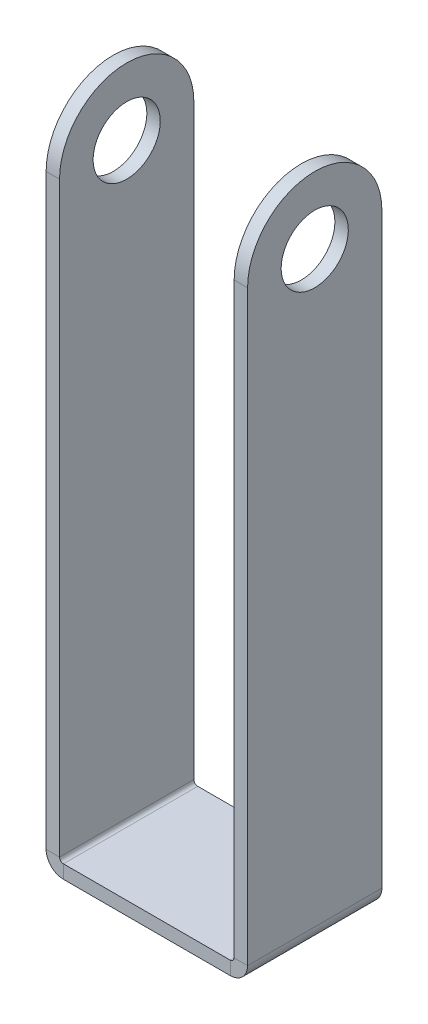
ISO-10303-21;
HEADER;
FILE_DESCRIPTION(('STEP AP214'),'2;1');
FILE_NAME('part.step','',(''),(''),'','','');
FILE_SCHEMA(('AUTOMOTIVE_DESIGN { 1 0 10303 214 1 1 1 1 }'));
ENDSEC;
DATA;
#1=APPLICATION_CONTEXT('core data for automotive mechanical design processes');
#2=APPLICATION_PROTOCOL_DEFINITION('international standard','automotive_design',2000,#1);
#3=PRODUCT_CONTEXT('',#1,'mechanical');
#4=PRODUCT('Part','Part','',(#3));
#5=PRODUCT_RELATED_PRODUCT_CATEGORY('part','',(#4));
#6=PRODUCT_DEFINITION_FORMATION('','',#4);
#7=PRODUCT_DEFINITION_CONTEXT('part definition',#1,'design');
#8=PRODUCT_DEFINITION('design','',#6,#7);
#9=PRODUCT_DEFINITION_SHAPE('','',#8);
#10=(LENGTH_UNIT() NAMED_UNIT(*) SI_UNIT(.MILLI.,.METRE.));
#11=(NAMED_UNIT(*) PLANE_ANGLE_UNIT() SI_UNIT($,.RADIAN.));
#12=(NAMED_UNIT(*) SI_UNIT($,.STERADIAN.) SOLID_ANGLE_UNIT());
#13=UNCERTAINTY_MEASURE_WITH_UNIT(LENGTH_MEASURE(1.E-05),#10,'distance_accuracy_value','');
#14=(GEOMETRIC_REPRESENTATION_CONTEXT(3) GLOBAL_UNCERTAINTY_ASSIGNED_CONTEXT((#13)) GLOBAL_UNIT_ASSIGNED_CONTEXT((#10,
#11,#12)) REPRESENTATION_CONTEXT('',''));
#15=CARTESIAN_POINT('',(0.,0.,0.));
#16=DIRECTION('',(0.,0.,1.));
#17=DIRECTION('',(1.,0.,0.));
#18=AXIS2_PLACEMENT_3D('',#15,#16,#17);
#19=CARTESIAN_POINT('',(19.05,0.,0.));
#20=DIRECTION('',(-1.,0.,0.));
#21=DIRECTION('',(0.,-1.,0.));
#22=AXIS2_PLACEMENT_3D('',#19,#20,#21);
#23=PLANE('',#22);
#24=CARTESIAN_POINT('',(19.0500000000004,111.76,0.));
#25=DIRECTION('',(1.,0.,0.));
#26=DIRECTION('',(0.,1.,0.));
#27=AXIS2_PLACEMENT_3D('',#24,#25,#26);
#28=CIRCLE('',#27,6.35);
#29=CARTESIAN_POINT('',(19.0500000000004,118.11,0.));
#30=VERTEX_POINT('',#29);
#31=EDGE_CURVE('E595',#30,#30,#28,.T.);
#32=ORIENTED_EDGE('',*,*,#31,.F.);
#33=EDGE_LOOP('',(#32));
#34=FACE_BOUND('',#33,.T.);
#35=CARTESIAN_POINT('',(19.0500000000004,111.76,0.));
#36=DIRECTION('',(1.,0.,0.));
#37=DIRECTION('',(0.,1.,0.));
#38=AXIS2_PLACEMENT_3D('',#35,#36,#37);
#39=CIRCLE('',#38,12.7);
#40=CARTESIAN_POINT('',(19.0500000000004,111.76,-12.7));
#41=VERTEX_POINT('',#40);
#42=CARTESIAN_POINT('',(19.0500000000004,111.76,12.7));
#43=VERTEX_POINT('',#42);
#44=EDGE_CURVE('E181',#41,#43,#39,.T.);
#45=ORIENTED_EDGE('',*,*,#44,.T.);
#46=DIRECTION('',(0.,-1.,0.));
#47=VECTOR('',#46,1.);
#48=CARTESIAN_POINT('',(19.05,0.,12.7));
#49=LINE('',#48,#47);
#50=CARTESIAN_POINT('',(19.05,0.736599999999988,12.7));
#51=VERTEX_POINT('',#50);
#52=EDGE_CURVE('E238',#43,#51,#49,.T.);
#53=ORIENTED_EDGE('',*,*,#52,.T.);
#54=DIRECTION('',(0.,0.,-1.));
#55=VECTOR('',#54,1.);
#56=CARTESIAN_POINT('',(19.05,0.736599999999988,12.7));
#57=LINE('',#56,#55);
#58=CARTESIAN_POINT('',(19.05,0.736599999999988,-12.7));
#59=VERTEX_POINT('',#58);
#60=EDGE_CURVE('E249',#59,#51,#57,.F.);
#61=ORIENTED_EDGE('',*,*,#60,.F.);
#62=DIRECTION('',(0.,1.,0.));
#63=VECTOR('',#62,1.);
#64=CARTESIAN_POINT('',(19.05,0.,-12.7));
#65=LINE('',#64,#63);
#66=EDGE_CURVE('E241',#59,#41,#65,.T.);
#67=ORIENTED_EDGE('',*,*,#66,.T.);
#68=EDGE_LOOP('',(#45,#53,#61,#67));
#69=FACE_BOUND('',#68,.T.);
#70=ADVANCED_FACE('F79',(#34,#69),#23,.F.);
#71=CARTESIAN_POINT('',(16.51,0.,0.));
#72=DIRECTION('',(-1.,0.,0.));
#73=DIRECTION('',(0.,-1.,0.));
#74=AXIS2_PLACEMENT_3D('',#71,#72,#73);
#75=PLANE('',#74);
#76=CARTESIAN_POINT('',(16.5100000000004,111.76,0.));
#77=DIRECTION('',(-1.,0.,0.));
#78=DIRECTION('',(0.,-1.,0.));
#79=AXIS2_PLACEMENT_3D('',#76,#77,#78);
#80=CIRCLE('',#79,6.35);
#81=CARTESIAN_POINT('',(16.5100000000004,105.41,0.));
#82=VERTEX_POINT('',#81);
#83=EDGE_CURVE('E593',#82,#82,#80,.T.);
#84=ORIENTED_EDGE('',*,*,#83,.F.);
#85=EDGE_LOOP('',(#84));
#86=FACE_BOUND('',#85,.T.);
#87=DIRECTION('',(0.,1.,0.));
#88=VECTOR('',#87,1.);
#89=CARTESIAN_POINT('',(16.51,0.,12.7));
#90=LINE('',#89,#88);
#91=CARTESIAN_POINT('',(16.5100000000002,111.76,12.7));
#92=VERTEX_POINT('',#91);
#93=CARTESIAN_POINT('',(16.51,0.736599999999997,12.7));
#94=VERTEX_POINT('',#93);
#95=EDGE_CURVE('E244',#92,#94,#90,.F.);
#96=ORIENTED_EDGE('',*,*,#95,.F.);
#97=CARTESIAN_POINT('',(16.5100000000004,111.76,0.));
#98=DIRECTION('',(-1.,0.,0.));
#99=DIRECTION('',(0.,-1.,0.));
#100=AXIS2_PLACEMENT_3D('',#97,#98,#99);
#101=CIRCLE('',#100,12.7);
#102=CARTESIAN_POINT('',(16.5100000000004,111.76,-12.7));
#103=VERTEX_POINT('',#102);
#104=EDGE_CURVE('E204',#92,#103,#101,.T.);
#105=ORIENTED_EDGE('',*,*,#104,.T.);
#106=DIRECTION('',(0.,-1.,0.));
#107=VECTOR('',#106,1.);
#108=CARTESIAN_POINT('',(16.5100000000004,124.46,-12.7));
#109=LINE('',#108,#107);
#110=CARTESIAN_POINT('',(16.51,0.736599999999997,-12.7));
#111=VERTEX_POINT('',#110);
#112=EDGE_CURVE('E246',#111,#103,#109,.F.);
#113=ORIENTED_EDGE('',*,*,#112,.F.);
#114=DIRECTION('',(0.,0.,-1.));
#115=VECTOR('',#114,1.);
#116=CARTESIAN_POINT('',(16.51,0.736599999999997,12.7));
#117=LINE('',#116,#115);
#118=EDGE_CURVE('E255',#94,#111,#117,.T.);
#119=ORIENTED_EDGE('',*,*,#118,.F.);
#120=EDGE_LOOP('',(#96,#105,#113,#119));
#121=FACE_BOUND('',#120,.T.);
#122=ADVANCED_FACE('F304',(#86,#121),#75,.T.);
#123=CARTESIAN_POINT('',(-19.05,0.,0.));
#124=DIRECTION('',(1.,0.,0.));
#125=DIRECTION('',(0.,1.,0.));
#126=AXIS2_PLACEMENT_3D('',#123,#124,#125);
#127=PLANE('',#126);
#128=CARTESIAN_POINT('',(-19.0500000000005,111.76,0.));
#129=DIRECTION('',(1.,0.,0.));
#130=DIRECTION('',(0.,1.,0.));
#131=AXIS2_PLACEMENT_3D('',#128,#129,#130);
#132=CIRCLE('',#131,6.35);
#133=CARTESIAN_POINT('',(-19.0500000000005,118.11,0.));
#134=VERTEX_POINT('',#133);
#135=EDGE_CURVE('E596',#134,#134,#132,.T.);
#136=ORIENTED_EDGE('',*,*,#135,.T.);
#137=EDGE_LOOP('',(#136));
#138=FACE_BOUND('',#137,.T.);
#139=DIRECTION('',(0.,1.,0.));
#140=VECTOR('',#139,1.);
#141=CARTESIAN_POINT('',(-19.05,0.,12.7));
#142=LINE('',#141,#140);
#143=CARTESIAN_POINT('',(-19.05,0.736599999999985,12.7));
#144=VERTEX_POINT('',#143);
#145=CARTESIAN_POINT('',(-19.0500000000005,111.76,12.7));
#146=VERTEX_POINT('',#145);
#147=EDGE_CURVE('E187',#144,#146,#142,.T.);
#148=ORIENTED_EDGE('',*,*,#147,.T.);
#149=CARTESIAN_POINT('',(-19.0500000000005,111.76,0.));
#150=DIRECTION('',(1.,0.,0.));
#151=DIRECTION('',(0.,1.,0.));
#152=AXIS2_PLACEMENT_3D('',#149,#150,#151);
#153=CIRCLE('',#152,12.7);
#154=CARTESIAN_POINT('',(-19.0500000000005,111.76,-12.7));
#155=VERTEX_POINT('',#154);
#156=EDGE_CURVE('E170',#155,#146,#153,.T.);
#157=ORIENTED_EDGE('',*,*,#156,.F.);
#158=DIRECTION('',(0.,-1.,0.));
#159=VECTOR('',#158,1.);
#160=CARTESIAN_POINT('',(-19.05,0.,-12.7));
#161=LINE('',#160,#159);
#162=CARTESIAN_POINT('',(-19.05,0.736599999999988,-12.7));
#163=VERTEX_POINT('',#162);
#164=EDGE_CURVE('E197',#155,#163,#161,.T.);
#165=ORIENTED_EDGE('',*,*,#164,.T.);
#166=DIRECTION('',(0.,0.,1.));
#167=VECTOR('',#166,1.);
#168=CARTESIAN_POINT('',(-19.05,0.736599999999988,-12.7));
#169=LINE('',#168,#167);
#170=EDGE_CURVE('E195',#144,#163,#169,.F.);
#171=ORIENTED_EDGE('',*,*,#170,.F.);
#172=EDGE_LOOP('',(#148,#157,#165,#171));
#173=FACE_BOUND('',#172,.T.);
#174=ADVANCED_FACE('F193',(#138,#173),#127,.F.);
#175=CARTESIAN_POINT('',(-16.51,0.,0.));
#176=DIRECTION('',(1.,0.,0.));
#177=DIRECTION('',(0.,1.,0.));
#178=AXIS2_PLACEMENT_3D('',#175,#176,#177);
#179=PLANE('',#178);
#180=CARTESIAN_POINT('',(-16.5100000000004,111.76,0.));
#181=DIRECTION('',(1.,0.,0.));
#182=DIRECTION('',(0.,1.,0.));
#183=AXIS2_PLACEMENT_3D('',#180,#181,#182);
#184=CIRCLE('',#183,6.35);
#185=CARTESIAN_POINT('',(-16.5100000000004,118.11,0.));
#186=VERTEX_POINT('',#185);
#187=EDGE_CURVE('E83',#186,#186,#184,.T.);
#188=ORIENTED_EDGE('',*,*,#187,.F.);
#189=EDGE_LOOP('',(#188));
#190=FACE_BOUND('',#189,.T.);
#191=CARTESIAN_POINT('',(-16.5100000000004,111.76,0.));
#192=DIRECTION('',(1.,0.,0.));
#193=DIRECTION('',(0.,1.,0.));
#194=AXIS2_PLACEMENT_3D('',#191,#192,#193);
#195=CIRCLE('',#194,12.7);
#196=CARTESIAN_POINT('',(-16.5100000000004,111.76,-12.7));
#197=VERTEX_POINT('',#196);
#198=CARTESIAN_POINT('',(-16.5100000000002,111.76,12.7));
#199=VERTEX_POINT('',#198);
#200=EDGE_CURVE('E337',#197,#199,#195,.T.);
#201=ORIENTED_EDGE('',*,*,#200,.T.);
#202=DIRECTION('',(0.,-1.,0.));
#203=VECTOR('',#202,1.);
#204=CARTESIAN_POINT('',(-16.5100000000004,124.46,12.7));
#205=LINE('',#204,#203);
#206=CARTESIAN_POINT('',(-16.51,0.736599999999993,12.7));
#207=VERTEX_POINT('',#206);
#208=EDGE_CURVE('E189',#207,#199,#205,.F.);
#209=ORIENTED_EDGE('',*,*,#208,.F.);
#210=DIRECTION('',(0.,0.,1.));
#211=VECTOR('',#210,1.);
#212=CARTESIAN_POINT('',(-16.51,0.736599999999997,-12.7));
#213=LINE('',#212,#211);
#214=CARTESIAN_POINT('',(-16.51,0.736599999999997,-12.7));
#215=VERTEX_POINT('',#214);
#216=EDGE_CURVE('E214',#215,#207,#213,.T.);
#217=ORIENTED_EDGE('',*,*,#216,.F.);
#218=DIRECTION('',(0.,1.,0.));
#219=VECTOR('',#218,1.);
#220=CARTESIAN_POINT('',(-16.51,0.,-12.7));
#221=LINE('',#220,#219);
#222=EDGE_CURVE('E208',#197,#215,#221,.F.);
#223=ORIENTED_EDGE('',*,*,#222,.F.);
#224=EDGE_LOOP('',(#201,#209,#217,#223));
#225=FACE_BOUND('',#224,.T.);
#226=ADVANCED_FACE('F336',(#190,#225),#179,.T.);
#227=CARTESIAN_POINT('',(19.05,0.,12.7));
#228=DIRECTION('',(0.,0.,-1.));
#229=DIRECTION('',(-1.,0.,0.));
#230=AXIS2_PLACEMENT_3D('',#227,#228,#229);
#231=PLANE('',#230);
#232=DIRECTION('',(1.,0.,0.));
#233=VECTOR('',#232,1.);
#234=CARTESIAN_POINT('',(-19.0500000000005,111.76,12.7));
#235=LINE('',#234,#233);
#236=EDGE_CURVE('E190',#92,#43,#235,.T.);
#237=ORIENTED_EDGE('',*,*,#236,.F.);
#238=ORIENTED_EDGE('',*,*,#95,.T.);
#239=DIRECTION('',(-1.,0.,0.));
#240=VECTOR('',#239,1.);
#241=CARTESIAN_POINT('',(19.05,0.736599999999988,12.7));
#242=LINE('',#241,#240);
#243=EDGE_CURVE('E236',#94,#51,#242,.F.);
#244=ORIENTED_EDGE('',*,*,#243,.T.);
#245=ORIENTED_EDGE('',*,*,#52,.F.);
#246=EDGE_LOOP('',(#237,#238,#244,#245));
#247=FACE_BOUND('',#246,.T.);
#248=ADVANCED_FACE('F299',(#247),#231,.F.);
#249=CARTESIAN_POINT('',(-19.0500000000004,124.46,12.7));
#250=DIRECTION('',(0.,0.,-1.));
#251=DIRECTION('',(-1.,0.,0.));
#252=AXIS2_PLACEMENT_3D('',#249,#250,#251);
#253=PLANE('',#252);
#254=EDGE_CURVE('E173',#146,#199,#235,.T.);
#255=ORIENTED_EDGE('',*,*,#254,.F.);
#256=ORIENTED_EDGE('',*,*,#147,.F.);
#257=DIRECTION('',(1.,0.,0.));
#258=VECTOR('',#257,1.);
#259=CARTESIAN_POINT('',(-16.51,0.736599999999993,12.7));
#260=LINE('',#259,#258);
#261=EDGE_CURVE('E211',#207,#144,#260,.F.);
#262=ORIENTED_EDGE('',*,*,#261,.F.);
#263=ORIENTED_EDGE('',*,*,#208,.T.);
#264=EDGE_LOOP('',(#255,#256,#262,#263));
#265=FACE_BOUND('',#264,.T.);
#266=ADVANCED_FACE('F185',(#265),#253,.F.);
#267=CARTESIAN_POINT('',(0.,-2.54,0.));
#268=DIRECTION('',(0.,1.,0.));
#269=DIRECTION('',(0.,0.,1.));
#270=AXIS2_PLACEMENT_3D('',#267,#268,#269);
#271=PLANE('',#270);
#272=DIRECTION('',(0.,0.,1.));
#273=VECTOR('',#272,1.);
#274=CARTESIAN_POINT('',(-15.7734,-2.54000000000001,12.7));
#275=LINE('',#274,#273);
#276=CARTESIAN_POINT('',(-15.7734,-2.54000000000001,12.7));
#277=VERTEX_POINT('',#276);
#278=CARTESIAN_POINT('',(-15.7734,-2.54,-12.7));
#279=VERTEX_POINT('',#278);
#280=EDGE_CURVE('E219',#277,#279,#275,.F.);
#281=ORIENTED_EDGE('',*,*,#280,.T.);
#282=DIRECTION('',(-1.,0.,0.));
#283=VECTOR('',#282,1.);
#284=CARTESIAN_POINT('',(-19.05,-2.54,-12.7));
#285=LINE('',#284,#283);
#286=CARTESIAN_POINT('',(15.7734,-2.54,-12.7));
#287=VERTEX_POINT('',#286);
#288=EDGE_CURVE('E88',#287,#279,#285,.T.);
#289=ORIENTED_EDGE('',*,*,#288,.F.);
#290=DIRECTION('',(0.,0.,-1.));
#291=VECTOR('',#290,1.);
#292=CARTESIAN_POINT('',(15.7734,-2.54,-12.7));
#293=LINE('',#292,#291);
#294=CARTESIAN_POINT('',(15.7734,-2.54,12.7));
#295=VERTEX_POINT('',#294);
#296=EDGE_CURVE('E259',#287,#295,#293,.F.);
#297=ORIENTED_EDGE('',*,*,#296,.T.);
#298=DIRECTION('',(1.,0.,0.));
#299=VECTOR('',#298,1.);
#300=CARTESIAN_POINT('',(-19.05,-2.54,12.7));
#301=LINE('',#300,#299);
#302=EDGE_CURVE('E13',#277,#295,#301,.T.);
#303=ORIENTED_EDGE('',*,*,#302,.F.);
#304=EDGE_LOOP('',(#281,#289,#297,#303));
#305=FACE_BOUND('',#304,.T.);
#306=ADVANCED_FACE('F320',(#305),#271,.F.);
#307=CARTESIAN_POINT('',(0.,0.,0.));
#308=DIRECTION('',(0.,1.,0.));
#309=DIRECTION('',(0.,0.,1.));
#310=AXIS2_PLACEMENT_3D('',#307,#308,#309);
#311=PLANE('',#310);
#312=DIRECTION('',(-1.,0.,0.));
#313=VECTOR('',#312,1.);
#314=CARTESIAN_POINT('',(-19.05,0.,-12.7));
#315=LINE('',#314,#313);
#316=CARTESIAN_POINT('',(15.7734,0.,-12.7));
#317=VERTEX_POINT('',#316);
#318=CARTESIAN_POINT('',(-15.7734,0.,-12.7));
#319=VERTEX_POINT('',#318);
#320=EDGE_CURVE('E277',#317,#319,#315,.T.);
#321=ORIENTED_EDGE('',*,*,#320,.T.);
#322=DIRECTION('',(0.,0.,1.));
#323=VECTOR('',#322,1.);
#324=CARTESIAN_POINT('',(-15.7734,0.,12.7));
#325=LINE('',#324,#323);
#326=CARTESIAN_POINT('',(-15.7734,0.,12.7));
#327=VERTEX_POINT('',#326);
#328=EDGE_CURVE('E200',#327,#319,#325,.F.);
#329=ORIENTED_EDGE('',*,*,#328,.F.);
#330=DIRECTION('',(1.,0.,0.));
#331=VECTOR('',#330,1.);
#332=CARTESIAN_POINT('',(-19.05,0.,12.7));
#333=LINE('',#332,#331);
#334=CARTESIAN_POINT('',(15.7734,0.,12.7));
#335=VERTEX_POINT('',#334);
#336=EDGE_CURVE('E281',#327,#335,#333,.T.);
#337=ORIENTED_EDGE('',*,*,#336,.T.);
#338=DIRECTION('',(0.,0.,-1.));
#339=VECTOR('',#338,1.);
#340=CARTESIAN_POINT('',(15.7734,0.,-12.7));
#341=LINE('',#340,#339);
#342=EDGE_CURVE('E96',#317,#335,#341,.F.);
#343=ORIENTED_EDGE('',*,*,#342,.F.);
#344=EDGE_LOOP('',(#321,#329,#337,#343));
#345=FACE_BOUND('',#344,.T.);
#346=ADVANCED_FACE('F284',(#345),#311,.T.);
#347=CARTESIAN_POINT('',(-19.05,-2.54,12.7));
#348=DIRECTION('',(0.,0.,1.));
#349=DIRECTION('',(1.,0.,0.));
#350=AXIS2_PLACEMENT_3D('',#347,#348,#349);
#351=PLANE('',#350);
#352=ORIENTED_EDGE('',*,*,#336,.F.);
#353=DIRECTION('',(0.,-1.,0.));
#354=VECTOR('',#353,1.);
#355=CARTESIAN_POINT('',(-15.7734,0.,12.7));
#356=LINE('',#355,#354);
#357=EDGE_CURVE('E225',#327,#277,#356,.T.);
#358=ORIENTED_EDGE('',*,*,#357,.T.);
#359=ORIENTED_EDGE('',*,*,#302,.T.);
#360=DIRECTION('',(0.,-1.,0.));
#361=VECTOR('',#360,1.);
#362=CARTESIAN_POINT('',(15.7734,0.,12.7));
#363=LINE('',#362,#361);
#364=EDGE_CURVE('E274',#335,#295,#363,.T.);
#365=ORIENTED_EDGE('',*,*,#364,.F.);
#366=EDGE_LOOP('',(#352,#358,#359,#365));
#367=FACE_BOUND('',#366,.T.);
#368=ADVANCED_FACE('F286',(#367),#351,.T.);
#369=CARTESIAN_POINT('',(-19.05,-2.54,-12.7));
#370=DIRECTION('',(0.,0.,-1.));
#371=DIRECTION('',(-1.,0.,0.));
#372=AXIS2_PLACEMENT_3D('',#369,#370,#371);
#373=PLANE('',#372);
#374=DIRECTION('',(0.,-1.,0.));
#375=VECTOR('',#374,1.);
#376=CARTESIAN_POINT('',(-15.7734,0.,-12.7));
#377=LINE('',#376,#375);
#378=EDGE_CURVE('E233',#319,#279,#377,.T.);
#379=ORIENTED_EDGE('',*,*,#378,.F.);
#380=ORIENTED_EDGE('',*,*,#320,.F.);
#381=DIRECTION('',(0.,-1.,0.));
#382=VECTOR('',#381,1.);
#383=CARTESIAN_POINT('',(15.7734,0.,-12.7));
#384=LINE('',#383,#382);
#385=EDGE_CURVE('E265',#317,#287,#384,.T.);
#386=ORIENTED_EDGE('',*,*,#385,.T.);
#387=ORIENTED_EDGE('',*,*,#288,.T.);
#388=EDGE_LOOP('',(#379,#380,#386,#387));
#389=FACE_BOUND('',#388,.T.);
#390=ADVANCED_FACE('F81',(#389),#373,.T.);
#391=CARTESIAN_POINT('',(15.7734,0.7366,12.7));
#392=DIRECTION('',(0.,0.,1.));
#393=DIRECTION('',(1.,0.,0.));
#394=AXIS2_PLACEMENT_3D('',#391,#392,#393);
#395=PLANE('',#394);
#396=ORIENTED_EDGE('',*,*,#243,.F.);
#397=CARTESIAN_POINT('',(15.7734,0.7366,12.7));
#398=DIRECTION('',(0.,0.,-1.));
#399=DIRECTION('',(-1.,0.,0.));
#400=AXIS2_PLACEMENT_3D('',#397,#398,#399);
#401=CIRCLE('',#400,0.7366);
#402=EDGE_CURVE('E268',#335,#94,#401,.F.);
#403=ORIENTED_EDGE('',*,*,#402,.F.);
#404=ORIENTED_EDGE('',*,*,#364,.T.);
#405=CARTESIAN_POINT('',(15.7734,0.7366,12.7));
#406=DIRECTION('',(0.,0.,-1.));
#407=DIRECTION('',(-1.,0.,0.));
#408=AXIS2_PLACEMENT_3D('',#405,#406,#407);
#409=CIRCLE('',#408,3.2766);
#410=EDGE_CURVE('E261',#295,#51,#409,.F.);
#411=ORIENTED_EDGE('',*,*,#410,.T.);
#412=EDGE_LOOP('',(#396,#403,#404,#411));
#413=FACE_BOUND('',#412,.T.);
#414=ADVANCED_FACE('F295',(#413),#395,.T.);
#415=CARTESIAN_POINT('',(15.7734,0.7366,-12.7));
#416=DIRECTION('',(0.,0.,1.));
#417=DIRECTION('',(1.,0.,0.));
#418=AXIS2_PLACEMENT_3D('',#415,#416,#417);
#419=PLANE('',#418);
#420=CARTESIAN_POINT('',(15.7734,0.7366,-12.7));
#421=DIRECTION('',(0.,0.,-1.));
#422=DIRECTION('',(-1.,0.,0.));
#423=AXIS2_PLACEMENT_3D('',#420,#421,#422);
#424=CIRCLE('',#423,0.7366);
#425=EDGE_CURVE('E240',#111,#317,#424,.T.);
#426=ORIENTED_EDGE('',*,*,#425,.F.);
#427=DIRECTION('',(-1.,0.,0.));
#428=VECTOR('',#427,1.);
#429=CARTESIAN_POINT('',(16.51,0.736599999999997,-12.7));
#430=LINE('',#429,#428);
#431=EDGE_CURVE('E252',#111,#59,#430,.F.);
#432=ORIENTED_EDGE('',*,*,#431,.T.);
#433=CARTESIAN_POINT('',(15.7734,0.7366,-12.7));
#434=DIRECTION('',(0.,0.,-1.));
#435=DIRECTION('',(-1.,0.,0.));
#436=AXIS2_PLACEMENT_3D('',#433,#434,#435);
#437=CIRCLE('',#436,3.2766);
#438=EDGE_CURVE('E262',#59,#287,#437,.T.);
#439=ORIENTED_EDGE('',*,*,#438,.T.);
#440=ORIENTED_EDGE('',*,*,#385,.F.);
#441=EDGE_LOOP('',(#426,#432,#439,#440));
#442=FACE_BOUND('',#441,.T.);
#443=ADVANCED_FACE('F309',(#442),#419,.F.);
#444=CARTESIAN_POINT('',(15.7734,0.7366,-12.7));
#445=DIRECTION('',(0.,0.,-1.));
#446=DIRECTION('',(1.,0.,0.));
#447=AXIS2_PLACEMENT_3D('',#444,#445,#446);
#448=CYLINDRICAL_SURFACE('',#447,3.2766);
#449=ORIENTED_EDGE('',*,*,#296,.F.);
#450=ORIENTED_EDGE('',*,*,#438,.F.);
#451=ORIENTED_EDGE('',*,*,#60,.T.);
#452=ORIENTED_EDGE('',*,*,#410,.F.);
#453=EDGE_LOOP('',(#449,#450,#451,#452));
#454=FACE_BOUND('',#453,.T.);
#455=ADVANCED_FACE('F318',(#454),#448,.T.);
#456=CARTESIAN_POINT('',(15.7734,0.7366,-12.7));
#457=DIRECTION('',(0.,0.,-1.));
#458=DIRECTION('',(1.,0.,0.));
#459=AXIS2_PLACEMENT_3D('',#456,#457,#458);
#460=CYLINDRICAL_SURFACE('',#459,0.7366);
#461=ORIENTED_EDGE('',*,*,#342,.T.);
#462=ORIENTED_EDGE('',*,*,#402,.T.);
#463=ORIENTED_EDGE('',*,*,#118,.T.);
#464=ORIENTED_EDGE('',*,*,#425,.T.);
#465=EDGE_LOOP('',(#461,#462,#463,#464));
#466=FACE_BOUND('',#465,.T.);
#467=ADVANCED_FACE('F291',(#466),#460,.F.);
#468=CARTESIAN_POINT('',(19.0500000000004,124.46,-12.7));
#469=DIRECTION('',(0.,0.,1.));
#470=DIRECTION('',(0.,-1.,0.));
#471=AXIS2_PLACEMENT_3D('',#468,#469,#470);
#472=PLANE('',#471);
#473=ORIENTED_EDGE('',*,*,#112,.T.);
#474=DIRECTION('',(1.,0.,0.));
#475=VECTOR('',#474,1.);
#476=CARTESIAN_POINT('',(-19.0500000000005,111.76,-12.7));
#477=LINE('',#476,#475);
#478=EDGE_CURVE('E180',#103,#41,#477,.T.);
#479=ORIENTED_EDGE('',*,*,#478,.T.);
#480=ORIENTED_EDGE('',*,*,#66,.F.);
#481=ORIENTED_EDGE('',*,*,#431,.F.);
#482=EDGE_LOOP('',(#473,#479,#480,#481));
#483=FACE_BOUND('',#482,.T.);
#484=ADVANCED_FACE('F313',(#483),#472,.F.);
#485=CARTESIAN_POINT('',(-15.7734,0.7366,-12.7));
#486=DIRECTION('',(0.,0.,-1.));
#487=DIRECTION('',(0.,1.,0.));
#488=AXIS2_PLACEMENT_3D('',#485,#486,#487);
#489=PLANE('',#488);
#490=DIRECTION('',(1.,0.,0.));
#491=VECTOR('',#490,1.);
#492=CARTESIAN_POINT('',(-19.05,0.736599999999988,-12.7));
#493=LINE('',#492,#491);
#494=EDGE_CURVE('E216',#215,#163,#493,.F.);
#495=ORIENTED_EDGE('',*,*,#494,.F.);
#496=CARTESIAN_POINT('',(-15.7734,0.7366,-12.7));
#497=DIRECTION('',(0.,0.,1.));
#498=DIRECTION('',(0.,-1.,0.));
#499=AXIS2_PLACEMENT_3D('',#496,#497,#498);
#500=CIRCLE('',#499,0.736600000000004);
#501=EDGE_CURVE('E228',#319,#215,#500,.F.);
#502=ORIENTED_EDGE('',*,*,#501,.F.);
#503=ORIENTED_EDGE('',*,*,#378,.T.);
#504=CARTESIAN_POINT('',(-15.7734,0.7366,-12.7));
#505=DIRECTION('',(0.,0.,1.));
#506=DIRECTION('',(0.,-1.,0.));
#507=AXIS2_PLACEMENT_3D('',#504,#505,#506);
#508=CIRCLE('',#507,3.2766);
#509=EDGE_CURVE('E221',#279,#163,#508,.F.);
#510=ORIENTED_EDGE('',*,*,#509,.T.);
#511=EDGE_LOOP('',(#495,#502,#503,#510));
#512=FACE_BOUND('',#511,.T.);
#513=ADVANCED_FACE('F330',(#512),#489,.T.);
#514=CARTESIAN_POINT('',(-15.7734,0.736599999999996,12.7));
#515=DIRECTION('',(0.,0.,-1.));
#516=DIRECTION('',(0.,1.,0.));
#517=AXIS2_PLACEMENT_3D('',#514,#515,#516);
#518=PLANE('',#517);
#519=CARTESIAN_POINT('',(-15.7734,0.736599999999996,12.7));
#520=DIRECTION('',(0.,0.,1.));
#521=DIRECTION('',(0.,-1.,0.));
#522=AXIS2_PLACEMENT_3D('',#519,#520,#521);
#523=CIRCLE('',#522,0.736600000000004);
#524=EDGE_CURVE('E196',#207,#327,#523,.T.);
#525=ORIENTED_EDGE('',*,*,#524,.F.);
#526=ORIENTED_EDGE('',*,*,#261,.T.);
#527=CARTESIAN_POINT('',(-15.7734,0.736599999999996,12.7));
#528=DIRECTION('',(0.,0.,1.));
#529=DIRECTION('',(0.,-1.,0.));
#530=AXIS2_PLACEMENT_3D('',#527,#528,#529);
#531=CIRCLE('',#530,3.2766);
#532=EDGE_CURVE('E222',#144,#277,#531,.T.);
#533=ORIENTED_EDGE('',*,*,#532,.T.);
#534=ORIENTED_EDGE('',*,*,#357,.F.);
#535=EDGE_LOOP('',(#525,#526,#533,#534));
#536=FACE_BOUND('',#535,.T.);
#537=ADVANCED_FACE('F339',(#536),#518,.F.);
#538=CARTESIAN_POINT('',(-15.7734,0.736599999999996,12.7));
#539=DIRECTION('',(0.,0.,1.));
#540=DIRECTION('',(-1.,0.,0.));
#541=AXIS2_PLACEMENT_3D('',#538,#539,#540);
#542=CYLINDRICAL_SURFACE('',#541,3.2766);
#543=ORIENTED_EDGE('',*,*,#280,.F.);
#544=ORIENTED_EDGE('',*,*,#532,.F.);
#545=ORIENTED_EDGE('',*,*,#170,.T.);
#546=ORIENTED_EDGE('',*,*,#509,.F.);
#547=EDGE_LOOP('',(#543,#544,#545,#546));
#548=FACE_BOUND('',#547,.T.);
#549=ADVANCED_FACE('F341',(#548),#542,.T.);
#550=CARTESIAN_POINT('',(-15.7734,0.736599999999996,12.7));
#551=DIRECTION('',(0.,0.,1.));
#552=DIRECTION('',(-1.,0.,0.));
#553=AXIS2_PLACEMENT_3D('',#550,#551,#552);
#554=CYLINDRICAL_SURFACE('',#553,0.736600000000004);
#555=ORIENTED_EDGE('',*,*,#328,.T.);
#556=ORIENTED_EDGE('',*,*,#501,.T.);
#557=ORIENTED_EDGE('',*,*,#216,.T.);
#558=ORIENTED_EDGE('',*,*,#524,.T.);
#559=EDGE_LOOP('',(#555,#556,#557,#558));
#560=FACE_BOUND('',#559,.T.);
#561=ADVANCED_FACE('F325',(#560),#554,.F.);
#562=CARTESIAN_POINT('',(-19.05,0.,-12.7));
#563=DIRECTION('',(0.,0.,1.));
#564=DIRECTION('',(1.,0.,0.));
#565=AXIS2_PLACEMENT_3D('',#562,#563,#564);
#566=PLANE('',#565);
#567=ORIENTED_EDGE('',*,*,#164,.F.);
#568=EDGE_CURVE('E176',#155,#197,#477,.T.);
#569=ORIENTED_EDGE('',*,*,#568,.T.);
#570=ORIENTED_EDGE('',*,*,#222,.T.);
#571=ORIENTED_EDGE('',*,*,#494,.T.);
#572=EDGE_LOOP('',(#567,#569,#570,#571));
#573=FACE_BOUND('',#572,.T.);
#574=ADVANCED_FACE('F333',(#573),#566,.F.);
#575=CARTESIAN_POINT('',(-19.0500000000005,111.76,0.));
#576=DIRECTION('',(1.,0.,0.));
#577=DIRECTION('',(0.,1.,0.));
#578=AXIS2_PLACEMENT_3D('',#575,#576,#577);
#579=CYLINDRICAL_SURFACE('',#578,12.7);
#580=ORIENTED_EDGE('',*,*,#568,.F.);
#581=ORIENTED_EDGE('',*,*,#156,.T.);
#582=ORIENTED_EDGE('',*,*,#254,.T.);
#583=ORIENTED_EDGE('',*,*,#200,.F.);
#584=EDGE_LOOP('',(#580,#581,#582,#583));
#585=FACE_BOUND('',#584,.T.);
#586=ADVANCED_FACE('F172',(#585),#579,.T.);
#587=ORIENTED_EDGE('',*,*,#104,.F.);
#588=ORIENTED_EDGE('',*,*,#236,.T.);
#589=ORIENTED_EDGE('',*,*,#44,.F.);
#590=ORIENTED_EDGE('',*,*,#478,.F.);
#591=EDGE_LOOP('',(#587,#588,#589,#590));
#592=FACE_BOUND('',#591,.T.);
#593=ADVANCED_FACE('F548',(#592),#579,.T.);
#594=CARTESIAN_POINT('',(-19.0500000000005,111.76,0.));
#595=DIRECTION('',(1.,0.,0.));
#596=DIRECTION('',(0.,1.,0.));
#597=AXIS2_PLACEMENT_3D('',#594,#595,#596);
#598=CYLINDRICAL_SURFACE('',#597,6.35);
#599=ORIENTED_EDGE('',*,*,#187,.T.);
#600=EDGE_LOOP('',(#599));
#601=FACE_BOUND('',#600,.T.);
#602=ORIENTED_EDGE('',*,*,#135,.F.);
#603=EDGE_LOOP('',(#602));
#604=FACE_BOUND('',#603,.T.);
#605=ADVANCED_FACE('F560',(#601,#604),#598,.F.);
#606=ORIENTED_EDGE('',*,*,#83,.T.);
#607=EDGE_LOOP('',(#606));
#608=FACE_BOUND('',#607,.T.);
#609=ORIENTED_EDGE('',*,*,#31,.T.);
#610=EDGE_LOOP('',(#609));
#611=FACE_BOUND('',#610,.T.);
#612=ADVANCED_FACE('F572',(#608,#611),#598,.F.);
#613=CLOSED_SHELL('',(#70,#122,#174,#226,#248,#266,#306,#346,#368,#390,#414,#443,#455,#467,#484,
#513,#537,#549,#561,#574,#586,#593,#605,#612));
#614=MANIFOLD_SOLID_BREP('B2',#613);
#615=ADVANCED_BREP_SHAPE_REPRESENTATION('',(#18,#614),#14);
#616=SHAPE_DEFINITION_REPRESENTATION(#9,#615);
ENDSEC;
END-ISO-10303-21;
